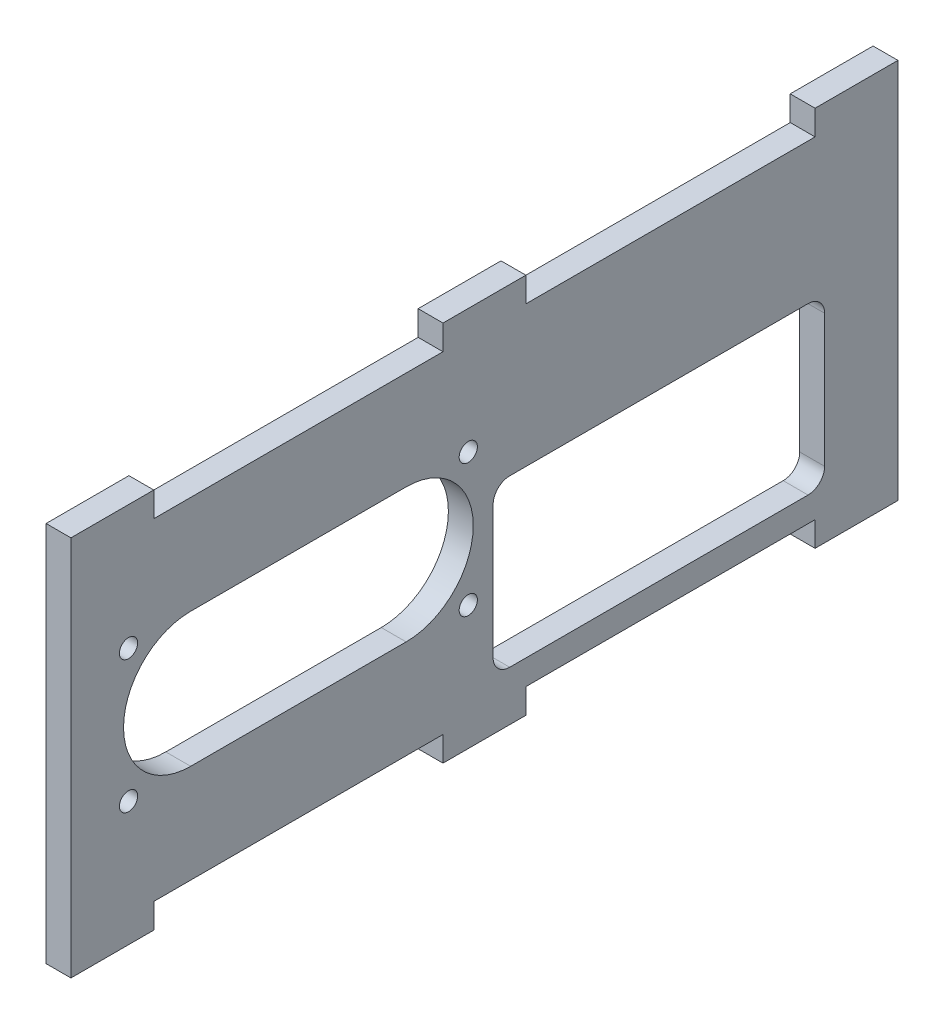
ISO-10303-21;
HEADER;
FILE_DESCRIPTION(('STEP AP214'),'2;1');
FILE_NAME('part.step','',(''),(''),'','','');
FILE_SCHEMA(('AUTOMOTIVE_DESIGN { 1 0 10303 214 1 1 1 1 }'));
ENDSEC;
DATA;
#1=APPLICATION_CONTEXT('core data for automotive mechanical design processes');
#2=APPLICATION_PROTOCOL_DEFINITION('international standard','automotive_design',2000,#1);
#3=PRODUCT_CONTEXT('',#1,'mechanical');
#4=PRODUCT('Part','Part','',(#3));
#5=PRODUCT_RELATED_PRODUCT_CATEGORY('part','',(#4));
#6=PRODUCT_DEFINITION_FORMATION('','',#4);
#7=PRODUCT_DEFINITION_CONTEXT('part definition',#1,'design');
#8=PRODUCT_DEFINITION('design','',#6,#7);
#9=PRODUCT_DEFINITION_SHAPE('','',#8);
#10=(LENGTH_UNIT() NAMED_UNIT(*) SI_UNIT(.MILLI.,.METRE.));
#11=(NAMED_UNIT(*) PLANE_ANGLE_UNIT() SI_UNIT($,.RADIAN.));
#12=(NAMED_UNIT(*) SI_UNIT($,.STERADIAN.) SOLID_ANGLE_UNIT());
#13=UNCERTAINTY_MEASURE_WITH_UNIT(LENGTH_MEASURE(1.E-05),#10,'distance_accuracy_value','');
#14=(GEOMETRIC_REPRESENTATION_CONTEXT(3) GLOBAL_UNCERTAINTY_ASSIGNED_CONTEXT((#13)) GLOBAL_UNIT_ASSIGNED_CONTEXT((#10,
#11,#12)) REPRESENTATION_CONTEXT('',''));
#15=CARTESIAN_POINT('',(0.,0.,0.));
#16=DIRECTION('',(0.,0.,1.));
#17=DIRECTION('',(1.,0.,0.));
#18=AXIS2_PLACEMENT_3D('',#15,#16,#17);
#19=CARTESIAN_POINT('',(3.,0.,-72.35));
#20=DIRECTION('',(0.,0.,-1.));
#21=DIRECTION('',(-1.,0.,0.));
#22=AXIS2_PLACEMENT_3D('',#19,#20,#21);
#23=PLANE('',#22);
#24=DIRECTION('',(0.,-1.,0.));
#25=VECTOR('',#24,1.);
#26=CARTESIAN_POINT('',(0.,0.,-72.35));
#27=LINE('',#26,#25);
#28=CARTESIAN_POINT('',(0.,23.,-72.35));
#29=VERTEX_POINT('',#28);
#30=CARTESIAN_POINT('',(0.,-23.,-72.35));
#31=VERTEX_POINT('',#30);
#32=EDGE_CURVE('E315',#29,#31,#27,.T.);
#33=ORIENTED_EDGE('',*,*,#32,.F.);
#34=DIRECTION('',(-1.,0.,0.));
#35=VECTOR('',#34,1.);
#36=CARTESIAN_POINT('',(3.,23.,-72.35));
#37=LINE('',#36,#35);
#38=CARTESIAN_POINT('',(3.,23.,-72.35));
#39=VERTEX_POINT('',#38);
#40=EDGE_CURVE('E515',#39,#29,#37,.T.);
#41=ORIENTED_EDGE('',*,*,#40,.F.);
#42=DIRECTION('',(0.,-1.,0.));
#43=VECTOR('',#42,1.);
#44=CARTESIAN_POINT('',(3.,0.,-72.35));
#45=LINE('',#44,#43);
#46=CARTESIAN_POINT('',(3.,-23.,-72.35));
#47=VERTEX_POINT('',#46);
#48=EDGE_CURVE('E319',#39,#47,#45,.T.);
#49=ORIENTED_EDGE('',*,*,#48,.T.);
#50=DIRECTION('',(-1.,0.,0.));
#51=VECTOR('',#50,1.);
#52=CARTESIAN_POINT('',(3.,-23.,-72.35));
#53=LINE('',#52,#51);
#54=EDGE_CURVE('E385',#47,#31,#53,.T.);
#55=ORIENTED_EDGE('',*,*,#54,.T.);
#56=EDGE_LOOP('',(#33,#41,#49,#55));
#57=FACE_BOUND('',#56,.T.);
#58=ADVANCED_FACE('F40',(#57),#23,.T.);
#59=CARTESIAN_POINT('',(3.,23.,0.));
#60=DIRECTION('',(0.,1.,0.));
#61=DIRECTION('',(0.,0.,1.));
#62=AXIS2_PLACEMENT_3D('',#59,#60,#61);
#63=PLANE('',#62);
#64=DIRECTION('',(0.,0.,-1.));
#65=VECTOR('',#64,1.);
#66=CARTESIAN_POINT('',(0.,23.,0.));
#67=LINE('',#66,#65);
#68=CARTESIAN_POINT('',(0.,23.,-62.35));
#69=VERTEX_POINT('',#68);
#70=EDGE_CURVE('E389',#69,#29,#67,.T.);
#71=ORIENTED_EDGE('',*,*,#70,.F.);
#72=DIRECTION('',(-1.,0.,0.));
#73=VECTOR('',#72,1.);
#74=CARTESIAN_POINT('',(3.,23.,-62.35));
#75=LINE('',#74,#73);
#76=CARTESIAN_POINT('',(3.,23.,-62.35));
#77=VERTEX_POINT('',#76);
#78=EDGE_CURVE('E512',#77,#69,#75,.T.);
#79=ORIENTED_EDGE('',*,*,#78,.F.);
#80=DIRECTION('',(0.,0.,-1.));
#81=VECTOR('',#80,1.);
#82=CARTESIAN_POINT('',(3.,23.,0.));
#83=LINE('',#82,#81);
#84=EDGE_CURVE('E323',#77,#39,#83,.T.);
#85=ORIENTED_EDGE('',*,*,#84,.T.);
#86=ORIENTED_EDGE('',*,*,#40,.T.);
#87=EDGE_LOOP('',(#71,#79,#85,#86));
#88=FACE_BOUND('',#87,.T.);
#89=ADVANCED_FACE('F651',(#88),#63,.T.);
#90=CARTESIAN_POINT('',(3.,1.44213344969539E-13,-62.3500000000001));
#91=DIRECTION('',(0.,0.,1.));
#92=DIRECTION('',(0.,-1.,0.));
#93=AXIS2_PLACEMENT_3D('',#90,#91,#92);
#94=PLANE('',#93);
#95=DIRECTION('',(0.,1.,0.));
#96=VECTOR('',#95,1.);
#97=CARTESIAN_POINT('',(0.,1.44213344969539E-13,-62.3500000000001));
#98=LINE('',#97,#96);
#99=CARTESIAN_POINT('',(0.,20.,-62.35));
#100=VERTEX_POINT('',#99);
#101=EDGE_CURVE('E393',#100,#69,#98,.T.);
#102=ORIENTED_EDGE('',*,*,#101,.F.);
#103=DIRECTION('',(-1.,0.,0.));
#104=VECTOR('',#103,1.);
#105=CARTESIAN_POINT('',(3.,20.,-62.35));
#106=LINE('',#105,#104);
#107=CARTESIAN_POINT('',(3.,20.,-62.35));
#108=VERTEX_POINT('',#107);
#109=EDGE_CURVE('E509',#108,#100,#106,.T.);
#110=ORIENTED_EDGE('',*,*,#109,.F.);
#111=DIRECTION('',(0.,1.,0.));
#112=VECTOR('',#111,1.);
#113=CARTESIAN_POINT('',(3.,1.44213344969539E-13,-62.3500000000001));
#114=LINE('',#113,#112);
#115=EDGE_CURVE('E328',#108,#77,#114,.T.);
#116=ORIENTED_EDGE('',*,*,#115,.T.);
#117=ORIENTED_EDGE('',*,*,#78,.T.);
#118=EDGE_LOOP('',(#102,#110,#116,#117));
#119=FACE_BOUND('',#118,.T.);
#120=ADVANCED_FACE('F655',(#119),#94,.T.);
#121=CARTESIAN_POINT('',(3.,20.,0.));
#122=DIRECTION('',(0.,1.,0.));
#123=DIRECTION('',(0.,0.,1.));
#124=AXIS2_PLACEMENT_3D('',#121,#122,#123);
#125=PLANE('',#124);
#126=DIRECTION('',(0.,0.,-1.));
#127=VECTOR('',#126,1.);
#128=CARTESIAN_POINT('',(0.,20.,0.));
#129=LINE('',#128,#127);
#130=CARTESIAN_POINT('',(0.,20.,-27.45));
#131=VERTEX_POINT('',#130);
#132=EDGE_CURVE('E397',#131,#100,#129,.T.);
#133=ORIENTED_EDGE('',*,*,#132,.F.);
#134=DIRECTION('',(-1.,0.,0.));
#135=VECTOR('',#134,1.);
#136=CARTESIAN_POINT('',(3.,20.,-27.45));
#137=LINE('',#136,#135);
#138=CARTESIAN_POINT('',(3.,20.,-27.45));
#139=VERTEX_POINT('',#138);
#140=EDGE_CURVE('E506',#139,#131,#137,.T.);
#141=ORIENTED_EDGE('',*,*,#140,.F.);
#142=DIRECTION('',(0.,0.,-1.));
#143=VECTOR('',#142,1.);
#144=CARTESIAN_POINT('',(3.,20.,0.));
#145=LINE('',#144,#143);
#146=EDGE_CURVE('E332',#139,#108,#145,.T.);
#147=ORIENTED_EDGE('',*,*,#146,.T.);
#148=ORIENTED_EDGE('',*,*,#109,.T.);
#149=EDGE_LOOP('',(#133,#141,#147,#148));
#150=FACE_BOUND('',#149,.T.);
#151=ADVANCED_FACE('F659',(#150),#125,.T.);
#152=CARTESIAN_POINT('',(3.,0.,-27.45));
#153=DIRECTION('',(0.,0.,1.));
#154=DIRECTION('',(1.,0.,0.));
#155=AXIS2_PLACEMENT_3D('',#152,#153,#154);
#156=PLANE('',#155);
#157=DIRECTION('',(0.,1.,0.));
#158=VECTOR('',#157,1.);
#159=CARTESIAN_POINT('',(0.,0.,-27.45));
#160=LINE('',#159,#158);
#161=CARTESIAN_POINT('',(0.,23.,-27.45));
#162=VERTEX_POINT('',#161);
#163=EDGE_CURVE('E401',#131,#162,#160,.T.);
#164=ORIENTED_EDGE('',*,*,#163,.T.);
#165=DIRECTION('',(-1.,0.,0.));
#166=VECTOR('',#165,1.);
#167=CARTESIAN_POINT('',(3.,23.,-27.45));
#168=LINE('',#167,#166);
#169=CARTESIAN_POINT('',(3.,23.,-27.45));
#170=VERTEX_POINT('',#169);
#171=EDGE_CURVE('E503',#170,#162,#168,.T.);
#172=ORIENTED_EDGE('',*,*,#171,.F.);
#173=DIRECTION('',(0.,1.,0.));
#174=VECTOR('',#173,1.);
#175=CARTESIAN_POINT('',(3.,0.,-27.45));
#176=LINE('',#175,#174);
#177=EDGE_CURVE('E336',#139,#170,#176,.T.);
#178=ORIENTED_EDGE('',*,*,#177,.F.);
#179=ORIENTED_EDGE('',*,*,#140,.T.);
#180=EDGE_LOOP('',(#164,#172,#178,#179));
#181=FACE_BOUND('',#180,.T.);
#182=ADVANCED_FACE('F664',(#181),#156,.F.);
#183=CARTESIAN_POINT('',(3.,23.,0.));
#184=DIRECTION('',(0.,1.,0.));
#185=DIRECTION('',(0.,0.,1.));
#186=AXIS2_PLACEMENT_3D('',#183,#184,#185);
#187=PLANE('',#186);
#188=DIRECTION('',(0.,0.,-1.));
#189=VECTOR('',#188,1.);
#190=CARTESIAN_POINT('',(0.,23.,0.));
#191=LINE('',#190,#189);
#192=CARTESIAN_POINT('',(0.,23.,-17.45));
#193=VERTEX_POINT('',#192);
#194=EDGE_CURVE('E406',#193,#162,#191,.T.);
#195=ORIENTED_EDGE('',*,*,#194,.F.);
#196=DIRECTION('',(-1.,0.,0.));
#197=VECTOR('',#196,1.);
#198=CARTESIAN_POINT('',(3.,23.,-17.45));
#199=LINE('',#198,#197);
#200=CARTESIAN_POINT('',(3.,23.,-17.45));
#201=VERTEX_POINT('',#200);
#202=EDGE_CURVE('E500',#201,#193,#199,.T.);
#203=ORIENTED_EDGE('',*,*,#202,.F.);
#204=DIRECTION('',(0.,0.,-1.));
#205=VECTOR('',#204,1.);
#206=CARTESIAN_POINT('',(3.,23.,0.));
#207=LINE('',#206,#205);
#208=EDGE_CURVE('E340',#201,#170,#207,.T.);
#209=ORIENTED_EDGE('',*,*,#208,.T.);
#210=ORIENTED_EDGE('',*,*,#171,.T.);
#211=EDGE_LOOP('',(#195,#203,#209,#210));
#212=FACE_BOUND('',#211,.T.);
#213=ADVANCED_FACE('F737',(#212),#187,.T.);
#214=CARTESIAN_POINT('',(3.,0.,-17.4500000000001));
#215=DIRECTION('',(0.,0.,1.));
#216=DIRECTION('',(0.,-1.,0.));
#217=AXIS2_PLACEMENT_3D('',#214,#215,#216);
#218=PLANE('',#217);
#219=DIRECTION('',(0.,1.,0.));
#220=VECTOR('',#219,1.);
#221=CARTESIAN_POINT('',(0.,0.,-17.4500000000001));
#222=LINE('',#221,#220);
#223=CARTESIAN_POINT('',(0.,20.,-17.45));
#224=VERTEX_POINT('',#223);
#225=EDGE_CURVE('E410',#224,#193,#222,.T.);
#226=ORIENTED_EDGE('',*,*,#225,.F.);
#227=DIRECTION('',(-1.,0.,0.));
#228=VECTOR('',#227,1.);
#229=CARTESIAN_POINT('',(3.,20.,-17.45));
#230=LINE('',#229,#228);
#231=CARTESIAN_POINT('',(3.,20.,-17.45));
#232=VERTEX_POINT('',#231);
#233=EDGE_CURVE('E497',#232,#224,#230,.T.);
#234=ORIENTED_EDGE('',*,*,#233,.F.);
#235=DIRECTION('',(0.,1.,0.));
#236=VECTOR('',#235,1.);
#237=CARTESIAN_POINT('',(3.,0.,-17.4500000000001));
#238=LINE('',#237,#236);
#239=EDGE_CURVE('E344',#232,#201,#238,.T.);
#240=ORIENTED_EDGE('',*,*,#239,.T.);
#241=ORIENTED_EDGE('',*,*,#202,.T.);
#242=EDGE_LOOP('',(#226,#234,#240,#241));
#243=FACE_BOUND('',#242,.T.);
#244=ADVANCED_FACE('F672',(#243),#218,.T.);
#245=CARTESIAN_POINT('',(0.,20.,17.45));
#246=VERTEX_POINT('',#245);
#247=EDGE_CURVE('E402',#246,#224,#129,.T.);
#248=ORIENTED_EDGE('',*,*,#247,.F.);
#249=DIRECTION('',(-1.,0.,0.));
#250=VECTOR('',#249,1.);
#251=CARTESIAN_POINT('',(3.,20.,17.45));
#252=LINE('',#251,#250);
#253=CARTESIAN_POINT('',(3.,20.,17.45));
#254=VERTEX_POINT('',#253);
#255=EDGE_CURVE('E494',#254,#246,#252,.T.);
#256=ORIENTED_EDGE('',*,*,#255,.F.);
#257=EDGE_CURVE('E337',#254,#232,#145,.T.);
#258=ORIENTED_EDGE('',*,*,#257,.T.);
#259=ORIENTED_EDGE('',*,*,#233,.T.);
#260=EDGE_LOOP('',(#248,#256,#258,#259));
#261=FACE_BOUND('',#260,.T.);
#262=ADVANCED_FACE('F677',(#261),#125,.T.);
#263=CARTESIAN_POINT('',(3.,0.,17.45));
#264=DIRECTION('',(0.,0.,1.));
#265=DIRECTION('',(1.,0.,0.));
#266=AXIS2_PLACEMENT_3D('',#263,#264,#265);
#267=PLANE('',#266);
#268=DIRECTION('',(0.,1.,0.));
#269=VECTOR('',#268,1.);
#270=CARTESIAN_POINT('',(0.,0.,17.45));
#271=LINE('',#270,#269);
#272=CARTESIAN_POINT('',(0.,23.,17.45));
#273=VERTEX_POINT('',#272);
#274=EDGE_CURVE('E414',#246,#273,#271,.T.);
#275=ORIENTED_EDGE('',*,*,#274,.T.);
#276=DIRECTION('',(-1.,0.,0.));
#277=VECTOR('',#276,1.);
#278=CARTESIAN_POINT('',(3.,23.,17.45));
#279=LINE('',#278,#277);
#280=CARTESIAN_POINT('',(3.,23.,17.45));
#281=VERTEX_POINT('',#280);
#282=EDGE_CURVE('E491',#281,#273,#279,.T.);
#283=ORIENTED_EDGE('',*,*,#282,.F.);
#284=DIRECTION('',(0.,1.,0.));
#285=VECTOR('',#284,1.);
#286=CARTESIAN_POINT('',(3.,0.,17.45));
#287=LINE('',#286,#285);
#288=EDGE_CURVE('E348',#254,#281,#287,.T.);
#289=ORIENTED_EDGE('',*,*,#288,.F.);
#290=ORIENTED_EDGE('',*,*,#255,.T.);
#291=EDGE_LOOP('',(#275,#283,#289,#290));
#292=FACE_BOUND('',#291,.T.);
#293=ADVANCED_FACE('F688',(#292),#267,.F.);
#294=CARTESIAN_POINT('',(3.,23.,0.));
#295=DIRECTION('',(0.,1.,0.));
#296=DIRECTION('',(0.,0.,1.));
#297=AXIS2_PLACEMENT_3D('',#294,#295,#296);
#298=PLANE('',#297);
#299=DIRECTION('',(0.,0.,-1.));
#300=VECTOR('',#299,1.);
#301=CARTESIAN_POINT('',(0.,23.,0.));
#302=LINE('',#301,#300);
#303=CARTESIAN_POINT('',(0.,23.,27.45));
#304=VERTEX_POINT('',#303);
#305=EDGE_CURVE('E418',#304,#273,#302,.T.);
#306=ORIENTED_EDGE('',*,*,#305,.F.);
#307=DIRECTION('',(-1.,0.,0.));
#308=VECTOR('',#307,1.);
#309=CARTESIAN_POINT('',(3.,23.,27.45));
#310=LINE('',#309,#308);
#311=CARTESIAN_POINT('',(3.,23.,27.45));
#312=VERTEX_POINT('',#311);
#313=EDGE_CURVE('E488',#312,#304,#310,.T.);
#314=ORIENTED_EDGE('',*,*,#313,.F.);
#315=DIRECTION('',(0.,0.,-1.));
#316=VECTOR('',#315,1.);
#317=CARTESIAN_POINT('',(3.,23.,0.));
#318=LINE('',#317,#316);
#319=EDGE_CURVE('E351',#312,#281,#318,.T.);
#320=ORIENTED_EDGE('',*,*,#319,.T.);
#321=ORIENTED_EDGE('',*,*,#282,.T.);
#322=EDGE_LOOP('',(#306,#314,#320,#321));
#323=FACE_BOUND('',#322,.T.);
#324=ADVANCED_FACE('F693',(#323),#298,.T.);
#325=CARTESIAN_POINT('',(3.,0.,27.45));
#326=DIRECTION('',(0.,0.,-1.));
#327=DIRECTION('',(0.,1.,0.));
#328=AXIS2_PLACEMENT_3D('',#325,#326,#327);
#329=PLANE('',#328);
#330=DIRECTION('',(0.,-1.,0.));
#331=VECTOR('',#330,1.);
#332=CARTESIAN_POINT('',(0.,0.,27.45));
#333=LINE('',#332,#331);
#334=CARTESIAN_POINT('',(0.,-23.,27.45));
#335=VERTEX_POINT('',#334);
#336=EDGE_CURVE('E422',#304,#335,#333,.T.);
#337=ORIENTED_EDGE('',*,*,#336,.T.);
#338=DIRECTION('',(-1.,0.,0.));
#339=VECTOR('',#338,1.);
#340=CARTESIAN_POINT('',(3.,-23.,27.45));
#341=LINE('',#340,#339);
#342=CARTESIAN_POINT('',(3.,-23.,27.45));
#343=VERTEX_POINT('',#342);
#344=EDGE_CURVE('E484',#343,#335,#341,.T.);
#345=ORIENTED_EDGE('',*,*,#344,.F.);
#346=DIRECTION('',(0.,-1.,0.));
#347=VECTOR('',#346,1.);
#348=CARTESIAN_POINT('',(3.,0.,27.45));
#349=LINE('',#348,#347);
#350=EDGE_CURVE('E355',#312,#343,#349,.T.);
#351=ORIENTED_EDGE('',*,*,#350,.F.);
#352=ORIENTED_EDGE('',*,*,#313,.T.);
#353=EDGE_LOOP('',(#337,#345,#351,#352));
#354=FACE_BOUND('',#353,.T.);
#355=ADVANCED_FACE('F695',(#354),#329,.F.);
#356=CARTESIAN_POINT('',(3.,-23.,0.));
#357=DIRECTION('',(0.,1.,0.));
#358=DIRECTION('',(0.,0.,1.));
#359=AXIS2_PLACEMENT_3D('',#356,#357,#358);
#360=PLANE('',#359);
#361=DIRECTION('',(0.,0.,-1.));
#362=VECTOR('',#361,1.);
#363=CARTESIAN_POINT('',(0.,-23.,0.));
#364=LINE('',#363,#362);
#365=CARTESIAN_POINT('',(0.,-23.,17.45));
#366=VERTEX_POINT('',#365);
#367=EDGE_CURVE('E425',#335,#366,#364,.T.);
#368=ORIENTED_EDGE('',*,*,#367,.T.);
#369=DIRECTION('',(-1.,0.,0.));
#370=VECTOR('',#369,1.);
#371=CARTESIAN_POINT('',(3.,-23.,17.45));
#372=LINE('',#371,#370);
#373=CARTESIAN_POINT('',(3.,-23.,17.45));
#374=VERTEX_POINT('',#373);
#375=EDGE_CURVE('E481',#374,#366,#372,.T.);
#376=ORIENTED_EDGE('',*,*,#375,.F.);
#377=DIRECTION('',(0.,0.,-1.));
#378=VECTOR('',#377,1.);
#379=CARTESIAN_POINT('',(3.,-23.,0.));
#380=LINE('',#379,#378);
#381=EDGE_CURVE('E358',#343,#374,#380,.T.);
#382=ORIENTED_EDGE('',*,*,#381,.F.);
#383=ORIENTED_EDGE('',*,*,#344,.T.);
#384=EDGE_LOOP('',(#368,#376,#382,#383));
#385=FACE_BOUND('',#384,.T.);
#386=ADVANCED_FACE('F700',(#385),#360,.F.);
#387=CARTESIAN_POINT('',(3.,1.81625547934769E-13,17.4499999999998));
#388=DIRECTION('',(0.,0.,-1.));
#389=DIRECTION('',(0.,1.,0.));
#390=AXIS2_PLACEMENT_3D('',#387,#388,#389);
#391=PLANE('',#390);
#392=DIRECTION('',(0.,-1.,0.));
#393=VECTOR('',#392,1.);
#394=CARTESIAN_POINT('',(0.,1.81625547934769E-13,17.4499999999998));
#395=LINE('',#394,#393);
#396=CARTESIAN_POINT('',(0.,-20.,17.45));
#397=VERTEX_POINT('',#396);
#398=EDGE_CURVE('E429',#397,#366,#395,.T.);
#399=ORIENTED_EDGE('',*,*,#398,.F.);
#400=DIRECTION('',(-1.,0.,0.));
#401=VECTOR('',#400,1.);
#402=CARTESIAN_POINT('',(3.,-20.,17.45));
#403=LINE('',#402,#401);
#404=CARTESIAN_POINT('',(3.,-20.,17.45));
#405=VERTEX_POINT('',#404);
#406=EDGE_CURVE('E478',#405,#397,#403,.T.);
#407=ORIENTED_EDGE('',*,*,#406,.F.);
#408=DIRECTION('',(0.,-1.,0.));
#409=VECTOR('',#408,1.);
#410=CARTESIAN_POINT('',(3.,1.81625547934769E-13,17.4499999999998));
#411=LINE('',#410,#409);
#412=EDGE_CURVE('E361',#405,#374,#411,.T.);
#413=ORIENTED_EDGE('',*,*,#412,.T.);
#414=ORIENTED_EDGE('',*,*,#375,.T.);
#415=EDGE_LOOP('',(#399,#407,#413,#414));
#416=FACE_BOUND('',#415,.T.);
#417=ADVANCED_FACE('F706',(#416),#391,.T.);
#418=CARTESIAN_POINT('',(3.,-20.,0.));
#419=DIRECTION('',(0.,1.,0.));
#420=DIRECTION('',(0.,0.,1.));
#421=AXIS2_PLACEMENT_3D('',#418,#419,#420);
#422=PLANE('',#421);
#423=DIRECTION('',(0.,0.,-1.));
#424=VECTOR('',#423,1.);
#425=CARTESIAN_POINT('',(0.,-20.,0.));
#426=LINE('',#425,#424);
#427=CARTESIAN_POINT('',(0.,-20.,-17.45));
#428=VERTEX_POINT('',#427);
#429=EDGE_CURVE('E433',#397,#428,#426,.T.);
#430=ORIENTED_EDGE('',*,*,#429,.T.);
#431=DIRECTION('',(-1.,0.,0.));
#432=VECTOR('',#431,1.);
#433=CARTESIAN_POINT('',(3.,-20.,-17.45));
#434=LINE('',#433,#432);
#435=CARTESIAN_POINT('',(3.,-20.,-17.45));
#436=VERTEX_POINT('',#435);
#437=EDGE_CURVE('E474',#436,#428,#434,.T.);
#438=ORIENTED_EDGE('',*,*,#437,.F.);
#439=DIRECTION('',(0.,0.,-1.));
#440=VECTOR('',#439,1.);
#441=CARTESIAN_POINT('',(3.,-20.,0.));
#442=LINE('',#441,#440);
#443=EDGE_CURVE('E365',#405,#436,#442,.T.);
#444=ORIENTED_EDGE('',*,*,#443,.F.);
#445=ORIENTED_EDGE('',*,*,#406,.T.);
#446=EDGE_LOOP('',(#430,#438,#444,#445));
#447=FACE_BOUND('',#446,.T.);
#448=ADVANCED_FACE('F709',(#447),#422,.F.);
#449=CARTESIAN_POINT('',(3.,1.00903082185984E-13,-17.4499999999999));
#450=DIRECTION('',(0.,0.,-1.));
#451=DIRECTION('',(0.,1.,0.));
#452=AXIS2_PLACEMENT_3D('',#449,#450,#451);
#453=PLANE('',#452);
#454=DIRECTION('',(0.,-1.,0.));
#455=VECTOR('',#454,1.);
#456=CARTESIAN_POINT('',(0.,1.00903082185984E-13,-17.4499999999999));
#457=LINE('',#456,#455);
#458=CARTESIAN_POINT('',(0.,-23.,-17.45));
#459=VERTEX_POINT('',#458);
#460=EDGE_CURVE('E436',#428,#459,#457,.T.);
#461=ORIENTED_EDGE('',*,*,#460,.T.);
#462=DIRECTION('',(-1.,0.,0.));
#463=VECTOR('',#462,1.);
#464=CARTESIAN_POINT('',(3.,-23.,-17.45));
#465=LINE('',#464,#463);
#466=CARTESIAN_POINT('',(3.,-23.,-17.45));
#467=VERTEX_POINT('',#466);
#468=EDGE_CURVE('E470',#467,#459,#465,.T.);
#469=ORIENTED_EDGE('',*,*,#468,.F.);
#470=DIRECTION('',(0.,-1.,0.));
#471=VECTOR('',#470,1.);
#472=CARTESIAN_POINT('',(3.,1.00903082185984E-13,-17.4499999999999));
#473=LINE('',#472,#471);
#474=EDGE_CURVE('E368',#436,#467,#473,.T.);
#475=ORIENTED_EDGE('',*,*,#474,.F.);
#476=ORIENTED_EDGE('',*,*,#437,.T.);
#477=EDGE_LOOP('',(#461,#469,#475,#476));
#478=FACE_BOUND('',#477,.T.);
#479=ADVANCED_FACE('F714',(#478),#453,.F.);
#480=CARTESIAN_POINT('',(3.,-23.,0.));
#481=DIRECTION('',(0.,1.,0.));
#482=DIRECTION('',(0.,0.,1.));
#483=AXIS2_PLACEMENT_3D('',#480,#481,#482);
#484=PLANE('',#483);
#485=DIRECTION('',(0.,0.,-1.));
#486=VECTOR('',#485,1.);
#487=CARTESIAN_POINT('',(0.,-23.,0.));
#488=LINE('',#487,#486);
#489=CARTESIAN_POINT('',(0.,-23.,-27.45));
#490=VERTEX_POINT('',#489);
#491=EDGE_CURVE('E440',#459,#490,#488,.T.);
#492=ORIENTED_EDGE('',*,*,#491,.T.);
#493=DIRECTION('',(-1.,0.,0.));
#494=VECTOR('',#493,1.);
#495=CARTESIAN_POINT('',(3.,-23.,-27.45));
#496=LINE('',#495,#494);
#497=CARTESIAN_POINT('',(3.,-23.,-27.45));
#498=VERTEX_POINT('',#497);
#499=EDGE_CURVE('E467',#498,#490,#496,.T.);
#500=ORIENTED_EDGE('',*,*,#499,.F.);
#501=DIRECTION('',(0.,0.,-1.));
#502=VECTOR('',#501,1.);
#503=CARTESIAN_POINT('',(3.,-23.,0.));
#504=LINE('',#503,#502);
#505=EDGE_CURVE('E372',#467,#498,#504,.T.);
#506=ORIENTED_EDGE('',*,*,#505,.F.);
#507=ORIENTED_EDGE('',*,*,#468,.T.);
#508=EDGE_LOOP('',(#492,#500,#506,#507));
#509=FACE_BOUND('',#508,.T.);
#510=ADVANCED_FACE('F719',(#509),#484,.F.);
#511=CARTESIAN_POINT('',(3.,0.,-27.45));
#512=DIRECTION('',(0.,0.,-1.));
#513=DIRECTION('',(-1.,0.,0.));
#514=AXIS2_PLACEMENT_3D('',#511,#512,#513);
#515=PLANE('',#514);
#516=DIRECTION('',(0.,-1.,0.));
#517=VECTOR('',#516,1.);
#518=CARTESIAN_POINT('',(0.,0.,-27.45));
#519=LINE('',#518,#517);
#520=CARTESIAN_POINT('',(0.,-20.,-27.45));
#521=VERTEX_POINT('',#520);
#522=EDGE_CURVE('E444',#521,#490,#519,.T.);
#523=ORIENTED_EDGE('',*,*,#522,.F.);
#524=DIRECTION('',(-1.,0.,0.));
#525=VECTOR('',#524,1.);
#526=CARTESIAN_POINT('',(3.,-20.,-27.45));
#527=LINE('',#526,#525);
#528=CARTESIAN_POINT('',(3.,-20.,-27.45));
#529=VERTEX_POINT('',#528);
#530=EDGE_CURVE('E464',#529,#521,#527,.T.);
#531=ORIENTED_EDGE('',*,*,#530,.F.);
#532=DIRECTION('',(0.,-1.,0.));
#533=VECTOR('',#532,1.);
#534=CARTESIAN_POINT('',(3.,0.,-27.45));
#535=LINE('',#534,#533);
#536=EDGE_CURVE('E375',#529,#498,#535,.T.);
#537=ORIENTED_EDGE('',*,*,#536,.T.);
#538=ORIENTED_EDGE('',*,*,#499,.T.);
#539=EDGE_LOOP('',(#523,#531,#537,#538));
#540=FACE_BOUND('',#539,.T.);
#541=ADVANCED_FACE('F723',(#540),#515,.T.);
#542=CARTESIAN_POINT('',(0.,-20.,-62.35));
#543=VERTEX_POINT('',#542);
#544=EDGE_CURVE('E437',#521,#543,#426,.T.);
#545=ORIENTED_EDGE('',*,*,#544,.T.);
#546=DIRECTION('',(-1.,0.,0.));
#547=VECTOR('',#546,1.);
#548=CARTESIAN_POINT('',(3.,-20.,-62.35));
#549=LINE('',#548,#547);
#550=CARTESIAN_POINT('',(3.,-20.,-62.35));
#551=VERTEX_POINT('',#550);
#552=EDGE_CURVE('E460',#551,#543,#549,.T.);
#553=ORIENTED_EDGE('',*,*,#552,.F.);
#554=EDGE_CURVE('E369',#529,#551,#442,.T.);
#555=ORIENTED_EDGE('',*,*,#554,.F.);
#556=ORIENTED_EDGE('',*,*,#530,.T.);
#557=EDGE_LOOP('',(#545,#553,#555,#556));
#558=FACE_BOUND('',#557,.T.);
#559=ADVANCED_FACE('F728',(#558),#422,.F.);
#560=CARTESIAN_POINT('',(3.,-1.44213344969539E-13,-62.3500000000001));
#561=DIRECTION('',(0.,0.,-1.));
#562=DIRECTION('',(0.,1.,0.));
#563=AXIS2_PLACEMENT_3D('',#560,#561,#562);
#564=PLANE('',#563);
#565=DIRECTION('',(0.,-1.,0.));
#566=VECTOR('',#565,1.);
#567=CARTESIAN_POINT('',(0.,-1.44213344969539E-13,-62.3500000000001));
#568=LINE('',#567,#566);
#569=CARTESIAN_POINT('',(0.,-23.,-62.35));
#570=VERTEX_POINT('',#569);
#571=EDGE_CURVE('E448',#543,#570,#568,.T.);
#572=ORIENTED_EDGE('',*,*,#571,.T.);
#573=DIRECTION('',(-1.,0.,0.));
#574=VECTOR('',#573,1.);
#575=CARTESIAN_POINT('',(3.,-23.,-62.35));
#576=LINE('',#575,#574);
#577=CARTESIAN_POINT('',(3.,-23.,-62.35));
#578=VERTEX_POINT('',#577);
#579=EDGE_CURVE('E456',#578,#570,#576,.T.);
#580=ORIENTED_EDGE('',*,*,#579,.F.);
#581=DIRECTION('',(0.,-1.,0.));
#582=VECTOR('',#581,1.);
#583=CARTESIAN_POINT('',(3.,-1.44213344969539E-13,-62.3500000000001));
#584=LINE('',#583,#582);
#585=EDGE_CURVE('E379',#551,#578,#584,.T.);
#586=ORIENTED_EDGE('',*,*,#585,.F.);
#587=ORIENTED_EDGE('',*,*,#552,.T.);
#588=EDGE_LOOP('',(#572,#580,#586,#587));
#589=FACE_BOUND('',#588,.T.);
#590=ADVANCED_FACE('F733',(#589),#564,.F.);
#591=CARTESIAN_POINT('',(3.,-23.,0.));
#592=DIRECTION('',(0.,1.,0.));
#593=DIRECTION('',(0.,0.,1.));
#594=AXIS2_PLACEMENT_3D('',#591,#592,#593);
#595=PLANE('',#594);
#596=DIRECTION('',(0.,0.,-1.));
#597=VECTOR('',#596,1.);
#598=CARTESIAN_POINT('',(0.,-23.,0.));
#599=LINE('',#598,#597);
#600=EDGE_CURVE('E324',#570,#31,#599,.T.);
#601=ORIENTED_EDGE('',*,*,#600,.T.);
#602=ORIENTED_EDGE('',*,*,#54,.F.);
#603=DIRECTION('',(0.,0.,-1.));
#604=VECTOR('',#603,1.);
#605=CARTESIAN_POINT('',(3.,-23.,0.));
#606=LINE('',#605,#604);
#607=EDGE_CURVE('E382',#578,#47,#606,.T.);
#608=ORIENTED_EDGE('',*,*,#607,.F.);
#609=ORIENTED_EDGE('',*,*,#579,.T.);
#610=EDGE_LOOP('',(#601,#602,#608,#609));
#611=FACE_BOUND('',#610,.T.);
#612=ADVANCED_FACE('F633',(#611),#595,.F.);
#613=CARTESIAN_POINT('',(3.,0.,0.));
#614=DIRECTION('',(1.,0.,0.));
#615=DIRECTION('',(0.,0.,-1.));
#616=AXIS2_PLACEMENT_3D('',#613,#614,#615);
#617=PLANE('',#616);
#618=DIRECTION('',(0.,-1.,0.));
#619=VECTOR('',#618,1.);
#620=CARTESIAN_POINT('',(3.,3.,-23.5));
#621=LINE('',#620,#619);
#622=CARTESIAN_POINT('',(3.,0.999999999999999,-23.5));
#623=VERTEX_POINT('',#622);
#624=CARTESIAN_POINT('',(3.,-15.,-23.5));
#625=VERTEX_POINT('',#624);
#626=EDGE_CURVE('E569',#623,#625,#621,.T.);
#627=ORIENTED_EDGE('',*,*,#626,.F.);
#628=CARTESIAN_POINT('',(3.,0.999999999999999,-25.5));
#629=DIRECTION('',(1.,0.,0.));
#630=DIRECTION('',(0.,0.,-1.));
#631=AXIS2_PLACEMENT_3D('',#628,#629,#630);
#632=CIRCLE('',#631,2.);
#633=CARTESIAN_POINT('',(3.,3.,-25.5));
#634=VERTEX_POINT('',#633);
#635=EDGE_CURVE('E49',#623,#634,#632,.F.);
#636=ORIENTED_EDGE('',*,*,#635,.T.);
#637=DIRECTION('',(0.,0.,1.));
#638=VECTOR('',#637,1.);
#639=CARTESIAN_POINT('',(3.,3.,-23.5));
#640=LINE('',#639,#638);
#641=CARTESIAN_POINT('',(3.,3.,-61.5));
#642=VERTEX_POINT('',#641);
#643=EDGE_CURVE('E567',#642,#634,#640,.T.);
#644=ORIENTED_EDGE('',*,*,#643,.F.);
#645=CARTESIAN_POINT('',(3.,0.999999999999999,-61.5));
#646=DIRECTION('',(1.,0.,0.));
#647=DIRECTION('',(0.,0.,-1.));
#648=AXIS2_PLACEMENT_3D('',#645,#646,#647);
#649=CIRCLE('',#648,2.);
#650=CARTESIAN_POINT('',(3.,0.999999999999999,-63.5));
#651=VERTEX_POINT('',#650);
#652=EDGE_CURVE('E557',#642,#651,#649,.F.);
#653=ORIENTED_EDGE('',*,*,#652,.T.);
#654=DIRECTION('',(0.,1.,0.));
#655=VECTOR('',#654,1.);
#656=CARTESIAN_POINT('',(3.,3.,-63.5));
#657=LINE('',#656,#655);
#658=CARTESIAN_POINT('',(3.,-15.,-63.5));
#659=VERTEX_POINT('',#658);
#660=EDGE_CURVE('E576',#659,#651,#657,.T.);
#661=ORIENTED_EDGE('',*,*,#660,.F.);
#662=CARTESIAN_POINT('',(3.,-15.,-61.5));
#663=DIRECTION('',(1.,0.,0.));
#664=DIRECTION('',(0.,0.,-1.));
#665=AXIS2_PLACEMENT_3D('',#662,#663,#664);
#666=CIRCLE('',#665,2.);
#667=CARTESIAN_POINT('',(3.,-17.,-61.5));
#668=VERTEX_POINT('',#667);
#669=EDGE_CURVE('E551',#659,#668,#666,.F.);
#670=ORIENTED_EDGE('',*,*,#669,.T.);
#671=DIRECTION('',(0.,0.,-1.));
#672=VECTOR('',#671,1.);
#673=CARTESIAN_POINT('',(3.,-17.,-23.5));
#674=LINE('',#673,#672);
#675=CARTESIAN_POINT('',(3.,-17.,-25.5));
#676=VERTEX_POINT('',#675);
#677=EDGE_CURVE('E602',#676,#668,#674,.T.);
#678=ORIENTED_EDGE('',*,*,#677,.F.);
#679=CARTESIAN_POINT('',(3.,-15.,-25.5));
#680=DIRECTION('',(1.,0.,0.));
#681=DIRECTION('',(0.,0.,-1.));
#682=AXIS2_PLACEMENT_3D('',#679,#680,#681);
#683=CIRCLE('',#682,2.);
#684=EDGE_CURVE('E545',#676,#625,#683,.F.);
#685=ORIENTED_EDGE('',*,*,#684,.T.);
#686=EDGE_LOOP('',(#627,#636,#644,#653,#661,#670,#678,#685));
#687=FACE_BOUND('',#686,.T.);
#688=CARTESIAN_POINT('',(3.,-8.,20.5));
#689=DIRECTION('',(1.,0.,0.));
#690=DIRECTION('',(0.,0.,-1.));
#691=AXIS2_PLACEMENT_3D('',#688,#689,#690);
#692=CIRCLE('',#691,1.1);
#693=CARTESIAN_POINT('',(3.,-8.,19.4));
#694=VERTEX_POINT('',#693);
#695=EDGE_CURVE('E286',#694,#694,#692,.T.);
#696=ORIENTED_EDGE('',*,*,#695,.F.);
#697=EDGE_LOOP('',(#696));
#698=FACE_BOUND('',#697,.T.);
#699=CARTESIAN_POINT('',(3.,0.,13.));
#700=DIRECTION('',(1.,0.,0.));
#701=DIRECTION('',(0.,0.,-1.));
#702=AXIS2_PLACEMENT_3D('',#699,#700,#701);
#703=CIRCLE('',#702,8.1);
#704=CARTESIAN_POINT('',(3.,8.1,13.));
#705=VERTEX_POINT('',#704);
#706=CARTESIAN_POINT('',(3.,-8.1,13.));
#707=VERTEX_POINT('',#706);
#708=EDGE_CURVE('E258',#705,#707,#703,.T.);
#709=ORIENTED_EDGE('',*,*,#708,.F.);
#710=DIRECTION('',(0.,0.,1.));
#711=VECTOR('',#710,1.);
#712=CARTESIAN_POINT('',(3.,8.1,13.));
#713=LINE('',#712,#711);
#714=CARTESIAN_POINT('',(3.,8.1,-13.));
#715=VERTEX_POINT('',#714);
#716=EDGE_CURVE('E279',#715,#705,#713,.T.);
#717=ORIENTED_EDGE('',*,*,#716,.F.);
#718=CARTESIAN_POINT('',(3.,0.,-13.));
#719=DIRECTION('',(1.,0.,0.));
#720=DIRECTION('',(0.,0.,-1.));
#721=AXIS2_PLACEMENT_3D('',#718,#719,#720);
#722=CIRCLE('',#721,8.1);
#723=CARTESIAN_POINT('',(3.,-8.1,-13.));
#724=VERTEX_POINT('',#723);
#725=EDGE_CURVE('E283',#724,#715,#722,.T.);
#726=ORIENTED_EDGE('',*,*,#725,.F.);
#727=DIRECTION('',(0.,0.,-1.));
#728=VECTOR('',#727,1.);
#729=CARTESIAN_POINT('',(3.,-8.1,13.));
#730=LINE('',#729,#728);
#731=EDGE_CURVE('E295',#707,#724,#730,.T.);
#732=ORIENTED_EDGE('',*,*,#731,.F.);
#733=EDGE_LOOP('',(#709,#717,#726,#732));
#734=FACE_BOUND('',#733,.T.);
#735=CARTESIAN_POINT('',(3.,8.,-20.5));
#736=DIRECTION('',(1.,0.,0.));
#737=DIRECTION('',(0.,0.,-1.));
#738=AXIS2_PLACEMENT_3D('',#735,#736,#737);
#739=CIRCLE('',#738,1.1);
#740=CARTESIAN_POINT('',(3.,8.,-21.6));
#741=VERTEX_POINT('',#740);
#742=EDGE_CURVE('E613',#741,#741,#739,.T.);
#743=ORIENTED_EDGE('',*,*,#742,.F.);
#744=EDGE_LOOP('',(#743));
#745=FACE_BOUND('',#744,.T.);
#746=CARTESIAN_POINT('',(3.,-8.,-20.5));
#747=DIRECTION('',(1.,0.,0.));
#748=DIRECTION('',(0.,0.,-1.));
#749=AXIS2_PLACEMENT_3D('',#746,#747,#748);
#750=CIRCLE('',#749,1.1);
#751=CARTESIAN_POINT('',(3.,-8.,-21.6));
#752=VERTEX_POINT('',#751);
#753=EDGE_CURVE('E599',#752,#752,#750,.T.);
#754=ORIENTED_EDGE('',*,*,#753,.F.);
#755=EDGE_LOOP('',(#754));
#756=FACE_BOUND('',#755,.T.);
#757=CARTESIAN_POINT('',(3.,8.,20.5));
#758=DIRECTION('',(1.,0.,0.));
#759=DIRECTION('',(0.,0.,-1.));
#760=AXIS2_PLACEMENT_3D('',#757,#758,#759);
#761=CIRCLE('',#760,1.1);
#762=CARTESIAN_POINT('',(3.,8.,19.4));
#763=VERTEX_POINT('',#762);
#764=EDGE_CURVE('E305',#763,#763,#761,.T.);
#765=ORIENTED_EDGE('',*,*,#764,.F.);
#766=EDGE_LOOP('',(#765));
#767=FACE_BOUND('',#766,.T.);
#768=ORIENTED_EDGE('',*,*,#48,.F.);
#769=ORIENTED_EDGE('',*,*,#84,.F.);
#770=ORIENTED_EDGE('',*,*,#115,.F.);
#771=ORIENTED_EDGE('',*,*,#146,.F.);
#772=ORIENTED_EDGE('',*,*,#177,.T.);
#773=ORIENTED_EDGE('',*,*,#208,.F.);
#774=ORIENTED_EDGE('',*,*,#239,.F.);
#775=ORIENTED_EDGE('',*,*,#257,.F.);
#776=ORIENTED_EDGE('',*,*,#288,.T.);
#777=ORIENTED_EDGE('',*,*,#319,.F.);
#778=ORIENTED_EDGE('',*,*,#350,.T.);
#779=ORIENTED_EDGE('',*,*,#381,.T.);
#780=ORIENTED_EDGE('',*,*,#412,.F.);
#781=ORIENTED_EDGE('',*,*,#443,.T.);
#782=ORIENTED_EDGE('',*,*,#474,.T.);
#783=ORIENTED_EDGE('',*,*,#505,.T.);
#784=ORIENTED_EDGE('',*,*,#536,.F.);
#785=ORIENTED_EDGE('',*,*,#554,.T.);
#786=ORIENTED_EDGE('',*,*,#585,.T.);
#787=ORIENTED_EDGE('',*,*,#607,.T.);
#788=EDGE_LOOP('',(#768,#769,#770,#771,#772,#773,#774,#775,#776,#777,#778,#779,#780,#781,#782,
#783,#784,#785,#786,#787));
#789=FACE_BOUND('',#788,.T.);
#790=ADVANCED_FACE('F565',(#687,#698,#734,#745,#756,#767,#789),#617,.T.);
#791=CARTESIAN_POINT('',(0.,0.,0.));
#792=DIRECTION('',(1.,0.,0.));
#793=DIRECTION('',(0.,0.,-1.));
#794=AXIS2_PLACEMENT_3D('',#791,#792,#793);
#795=PLANE('',#794);
#796=DIRECTION('',(0.,1.,0.));
#797=VECTOR('',#796,1.);
#798=CARTESIAN_POINT('',(0.,3.,-63.5));
#799=LINE('',#798,#797);
#800=CARTESIAN_POINT('',(0.,-15.,-63.5));
#801=VERTEX_POINT('',#800);
#802=CARTESIAN_POINT('',(0.,0.999999999999999,-63.5));
#803=VERTEX_POINT('',#802);
#804=EDGE_CURVE('E592',#801,#803,#799,.T.);
#805=ORIENTED_EDGE('',*,*,#804,.T.);
#806=CARTESIAN_POINT('',(0.,0.999999999999999,-61.5));
#807=DIRECTION('',(1.,0.,0.));
#808=DIRECTION('',(0.,0.,-1.));
#809=AXIS2_PLACEMENT_3D('',#806,#807,#808);
#810=CIRCLE('',#809,2.);
#811=CARTESIAN_POINT('',(0.,3.,-61.5));
#812=VERTEX_POINT('',#811);
#813=EDGE_CURVE('E63',#803,#812,#810,.T.);
#814=ORIENTED_EDGE('',*,*,#813,.T.);
#815=DIRECTION('',(0.,0.,1.));
#816=VECTOR('',#815,1.);
#817=CARTESIAN_POINT('',(0.,3.,-23.5));
#818=LINE('',#817,#816);
#819=CARTESIAN_POINT('',(0.,3.,-25.5));
#820=VERTEX_POINT('',#819);
#821=EDGE_CURVE('E583',#812,#820,#818,.T.);
#822=ORIENTED_EDGE('',*,*,#821,.T.);
#823=CARTESIAN_POINT('',(0.,0.999999999999999,-25.5));
#824=DIRECTION('',(1.,0.,0.));
#825=DIRECTION('',(0.,0.,-1.));
#826=AXIS2_PLACEMENT_3D('',#823,#824,#825);
#827=CIRCLE('',#826,2.);
#828=CARTESIAN_POINT('',(0.,0.999999999999999,-23.5));
#829=VERTEX_POINT('',#828);
#830=EDGE_CURVE('E11',#820,#829,#827,.T.);
#831=ORIENTED_EDGE('',*,*,#830,.T.);
#832=DIRECTION('',(0.,-1.,0.));
#833=VECTOR('',#832,1.);
#834=CARTESIAN_POINT('',(0.,3.,-23.5));
#835=LINE('',#834,#833);
#836=CARTESIAN_POINT('',(0.,-15.,-23.5));
#837=VERTEX_POINT('',#836);
#838=EDGE_CURVE('E575',#829,#837,#835,.T.);
#839=ORIENTED_EDGE('',*,*,#838,.T.);
#840=CARTESIAN_POINT('',(0.,-15.,-25.5));
#841=DIRECTION('',(1.,0.,0.));
#842=DIRECTION('',(0.,0.,-1.));
#843=AXIS2_PLACEMENT_3D('',#840,#841,#842);
#844=CIRCLE('',#843,2.);
#845=CARTESIAN_POINT('',(0.,-17.,-25.5));
#846=VERTEX_POINT('',#845);
#847=EDGE_CURVE('E548',#837,#846,#844,.T.);
#848=ORIENTED_EDGE('',*,*,#847,.T.);
#849=DIRECTION('',(0.,0.,-1.));
#850=VECTOR('',#849,1.);
#851=CARTESIAN_POINT('',(0.,-17.,-23.5));
#852=LINE('',#851,#850);
#853=CARTESIAN_POINT('',(0.,-17.,-61.5));
#854=VERTEX_POINT('',#853);
#855=EDGE_CURVE('E588',#846,#854,#852,.T.);
#856=ORIENTED_EDGE('',*,*,#855,.T.);
#857=CARTESIAN_POINT('',(0.,-15.,-61.5));
#858=DIRECTION('',(1.,0.,0.));
#859=DIRECTION('',(0.,0.,-1.));
#860=AXIS2_PLACEMENT_3D('',#857,#858,#859);
#861=CIRCLE('',#860,2.);
#862=EDGE_CURVE('E554',#854,#801,#861,.T.);
#863=ORIENTED_EDGE('',*,*,#862,.T.);
#864=EDGE_LOOP('',(#805,#814,#822,#831,#839,#848,#856,#863));
#865=FACE_BOUND('',#864,.T.);
#866=CARTESIAN_POINT('',(0.,-8.,20.5));
#867=DIRECTION('',(1.,0.,0.));
#868=DIRECTION('',(0.,0.,-1.));
#869=AXIS2_PLACEMENT_3D('',#866,#867,#868);
#870=CIRCLE('',#869,1.1);
#871=CARTESIAN_POINT('',(0.,-8.,19.4));
#872=VERTEX_POINT('',#871);
#873=EDGE_CURVE('E296',#872,#872,#870,.T.);
#874=ORIENTED_EDGE('',*,*,#873,.T.);
#875=EDGE_LOOP('',(#874));
#876=FACE_BOUND('',#875,.T.);
#877=DIRECTION('',(0.,0.,1.));
#878=VECTOR('',#877,1.);
#879=CARTESIAN_POINT('',(0.,8.1,13.));
#880=LINE('',#879,#878);
#881=CARTESIAN_POINT('',(0.,8.1,-13.));
#882=VERTEX_POINT('',#881);
#883=CARTESIAN_POINT('',(0.,8.1,13.));
#884=VERTEX_POINT('',#883);
#885=EDGE_CURVE('E264',#882,#884,#880,.T.);
#886=ORIENTED_EDGE('',*,*,#885,.T.);
#887=CARTESIAN_POINT('',(0.,0.,13.));
#888=DIRECTION('',(1.,0.,0.));
#889=DIRECTION('',(0.,0.,-1.));
#890=AXIS2_PLACEMENT_3D('',#887,#888,#889);
#891=CIRCLE('',#890,8.1);
#892=CARTESIAN_POINT('',(0.,-8.1,13.));
#893=VERTEX_POINT('',#892);
#894=EDGE_CURVE('E255',#884,#893,#891,.T.);
#895=ORIENTED_EDGE('',*,*,#894,.T.);
#896=DIRECTION('',(0.,0.,-1.));
#897=VECTOR('',#896,1.);
#898=CARTESIAN_POINT('',(0.,-8.1,13.));
#899=LINE('',#898,#897);
#900=CARTESIAN_POINT('',(0.,-8.1,-13.));
#901=VERTEX_POINT('',#900);
#902=EDGE_CURVE('E268',#893,#901,#899,.T.);
#903=ORIENTED_EDGE('',*,*,#902,.T.);
#904=CARTESIAN_POINT('',(0.,0.,-13.));
#905=DIRECTION('',(1.,0.,0.));
#906=DIRECTION('',(0.,0.,-1.));
#907=AXIS2_PLACEMENT_3D('',#904,#905,#906);
#908=CIRCLE('',#907,8.1);
#909=EDGE_CURVE('E273',#901,#882,#908,.T.);
#910=ORIENTED_EDGE('',*,*,#909,.T.);
#911=EDGE_LOOP('',(#886,#895,#903,#910));
#912=FACE_BOUND('',#911,.T.);
#913=CARTESIAN_POINT('',(0.,8.,-20.5));
#914=DIRECTION('',(1.,0.,0.));
#915=DIRECTION('',(0.,0.,-1.));
#916=AXIS2_PLACEMENT_3D('',#913,#914,#915);
#917=CIRCLE('',#916,1.1);
#918=CARTESIAN_POINT('',(0.,8.,-21.6));
#919=VERTEX_POINT('',#918);
#920=EDGE_CURVE('E609',#919,#919,#917,.T.);
#921=ORIENTED_EDGE('',*,*,#920,.T.);
#922=EDGE_LOOP('',(#921));
#923=FACE_BOUND('',#922,.T.);
#924=CARTESIAN_POINT('',(0.,-8.,-20.5));
#925=DIRECTION('',(1.,0.,0.));
#926=DIRECTION('',(0.,0.,-1.));
#927=AXIS2_PLACEMENT_3D('',#924,#925,#926);
#928=CIRCLE('',#927,1.1);
#929=CARTESIAN_POINT('',(0.,-8.,-21.6));
#930=VERTEX_POINT('',#929);
#931=EDGE_CURVE('E617',#930,#930,#928,.T.);
#932=ORIENTED_EDGE('',*,*,#931,.T.);
#933=EDGE_LOOP('',(#932));
#934=FACE_BOUND('',#933,.T.);
#935=CARTESIAN_POINT('',(0.,8.,20.5));
#936=DIRECTION('',(1.,0.,0.));
#937=DIRECTION('',(0.,0.,-1.));
#938=AXIS2_PLACEMENT_3D('',#935,#936,#937);
#939=CIRCLE('',#938,1.1);
#940=CARTESIAN_POINT('',(0.,8.,19.4));
#941=VERTEX_POINT('',#940);
#942=EDGE_CURVE('E311',#941,#941,#939,.T.);
#943=ORIENTED_EDGE('',*,*,#942,.T.);
#944=EDGE_LOOP('',(#943));
#945=FACE_BOUND('',#944,.T.);
#946=ORIENTED_EDGE('',*,*,#32,.T.);
#947=ORIENTED_EDGE('',*,*,#600,.F.);
#948=ORIENTED_EDGE('',*,*,#571,.F.);
#949=ORIENTED_EDGE('',*,*,#544,.F.);
#950=ORIENTED_EDGE('',*,*,#522,.T.);
#951=ORIENTED_EDGE('',*,*,#491,.F.);
#952=ORIENTED_EDGE('',*,*,#460,.F.);
#953=ORIENTED_EDGE('',*,*,#429,.F.);
#954=ORIENTED_EDGE('',*,*,#398,.T.);
#955=ORIENTED_EDGE('',*,*,#367,.F.);
#956=ORIENTED_EDGE('',*,*,#336,.F.);
#957=ORIENTED_EDGE('',*,*,#305,.T.);
#958=ORIENTED_EDGE('',*,*,#274,.F.);
#959=ORIENTED_EDGE('',*,*,#247,.T.);
#960=ORIENTED_EDGE('',*,*,#225,.T.);
#961=ORIENTED_EDGE('',*,*,#194,.T.);
#962=ORIENTED_EDGE('',*,*,#163,.F.);
#963=ORIENTED_EDGE('',*,*,#132,.T.);
#964=ORIENTED_EDGE('',*,*,#101,.T.);
#965=ORIENTED_EDGE('',*,*,#70,.T.);
#966=EDGE_LOOP('',(#946,#947,#948,#949,#950,#951,#952,#953,#954,#955,#956,#957,#958,#959,#960,
#961,#962,#963,#964,#965));
#967=FACE_BOUND('',#966,.T.);
#968=ADVANCED_FACE('F275',(#865,#876,#912,#923,#934,#945,#967),#795,.F.);
#969=CARTESIAN_POINT('',(0.,8.,20.5));
#970=DIRECTION('',(1.,0.,0.));
#971=DIRECTION('',(0.,0.,-1.));
#972=AXIS2_PLACEMENT_3D('',#969,#970,#971);
#973=CYLINDRICAL_SURFACE('',#972,1.1);
#974=ORIENTED_EDGE('',*,*,#942,.F.);
#975=EDGE_LOOP('',(#974));
#976=FACE_BOUND('',#975,.T.);
#977=ORIENTED_EDGE('',*,*,#764,.T.);
#978=EDGE_LOOP('',(#977));
#979=FACE_BOUND('',#978,.T.);
#980=ADVANCED_FACE('F798',(#976,#979),#973,.F.);
#981=CARTESIAN_POINT('',(0.,-8.,-20.5));
#982=DIRECTION('',(1.,0.,0.));
#983=DIRECTION('',(0.,0.,-1.));
#984=AXIS2_PLACEMENT_3D('',#981,#982,#983);
#985=CYLINDRICAL_SURFACE('',#984,1.1);
#986=ORIENTED_EDGE('',*,*,#931,.F.);
#987=EDGE_LOOP('',(#986));
#988=FACE_BOUND('',#987,.T.);
#989=ORIENTED_EDGE('',*,*,#753,.T.);
#990=EDGE_LOOP('',(#989));
#991=FACE_BOUND('',#990,.T.);
#992=ADVANCED_FACE('F794',(#988,#991),#985,.F.);
#993=CARTESIAN_POINT('',(0.,8.,-20.5));
#994=DIRECTION('',(1.,0.,0.));
#995=DIRECTION('',(0.,0.,-1.));
#996=AXIS2_PLACEMENT_3D('',#993,#994,#995);
#997=CYLINDRICAL_SURFACE('',#996,1.1);
#998=ORIENTED_EDGE('',*,*,#920,.F.);
#999=EDGE_LOOP('',(#998));
#1000=FACE_BOUND('',#999,.T.);
#1001=ORIENTED_EDGE('',*,*,#742,.T.);
#1002=EDGE_LOOP('',(#1001));
#1003=FACE_BOUND('',#1002,.T.);
#1004=ADVANCED_FACE('F791',(#1000,#1003),#997,.F.);
#1005=CARTESIAN_POINT('',(0.,0.,13.));
#1006=DIRECTION('',(1.,0.,0.));
#1007=DIRECTION('',(0.,0.,-1.));
#1008=AXIS2_PLACEMENT_3D('',#1005,#1006,#1007);
#1009=CYLINDRICAL_SURFACE('',#1008,8.1);
#1010=ORIENTED_EDGE('',*,*,#708,.T.);
#1011=DIRECTION('',(1.,0.,0.));
#1012=VECTOR('',#1011,1.);
#1013=CARTESIAN_POINT('',(0.,-8.1,13.));
#1014=LINE('',#1013,#1012);
#1015=EDGE_CURVE('E251',#893,#707,#1014,.T.);
#1016=ORIENTED_EDGE('',*,*,#1015,.F.);
#1017=ORIENTED_EDGE('',*,*,#894,.F.);
#1018=DIRECTION('',(1.,0.,0.));
#1019=VECTOR('',#1018,1.);
#1020=CARTESIAN_POINT('',(0.,8.1,13.));
#1021=LINE('',#1020,#1019);
#1022=EDGE_CURVE('E302',#884,#705,#1021,.T.);
#1023=ORIENTED_EDGE('',*,*,#1022,.T.);
#1024=EDGE_LOOP('',(#1010,#1016,#1017,#1023));
#1025=FACE_BOUND('',#1024,.T.);
#1026=ADVANCED_FACE('F253',(#1025),#1009,.F.);
#1027=CARTESIAN_POINT('',(0.,8.1,13.));
#1028=DIRECTION('',(0.,1.,0.));
#1029=DIRECTION('',(0.,0.,1.));
#1030=AXIS2_PLACEMENT_3D('',#1027,#1028,#1029);
#1031=PLANE('',#1030);
#1032=ORIENTED_EDGE('',*,*,#716,.T.);
#1033=ORIENTED_EDGE('',*,*,#1022,.F.);
#1034=ORIENTED_EDGE('',*,*,#885,.F.);
#1035=DIRECTION('',(1.,0.,0.));
#1036=VECTOR('',#1035,1.);
#1037=CARTESIAN_POINT('',(0.,8.1,-13.));
#1038=LINE('',#1037,#1036);
#1039=EDGE_CURVE('E306',#882,#715,#1038,.T.);
#1040=ORIENTED_EDGE('',*,*,#1039,.T.);
#1041=EDGE_LOOP('',(#1032,#1033,#1034,#1040));
#1042=FACE_BOUND('',#1041,.T.);
#1043=ADVANCED_FACE('F803',(#1042),#1031,.F.);
#1044=CARTESIAN_POINT('',(0.,0.,-13.));
#1045=DIRECTION('',(1.,0.,0.));
#1046=DIRECTION('',(0.,0.,-1.));
#1047=AXIS2_PLACEMENT_3D('',#1044,#1045,#1046);
#1048=CYLINDRICAL_SURFACE('',#1047,8.1);
#1049=ORIENTED_EDGE('',*,*,#725,.T.);
#1050=ORIENTED_EDGE('',*,*,#1039,.F.);
#1051=ORIENTED_EDGE('',*,*,#909,.F.);
#1052=DIRECTION('',(1.,0.,0.));
#1053=VECTOR('',#1052,1.);
#1054=CARTESIAN_POINT('',(0.,-8.1,-13.));
#1055=LINE('',#1054,#1053);
#1056=EDGE_CURVE('E263',#901,#724,#1055,.T.);
#1057=ORIENTED_EDGE('',*,*,#1056,.T.);
#1058=EDGE_LOOP('',(#1049,#1050,#1051,#1057));
#1059=FACE_BOUND('',#1058,.T.);
#1060=ADVANCED_FACE('F806',(#1059),#1048,.F.);
#1061=CARTESIAN_POINT('',(0.,-8.1,13.));
#1062=DIRECTION('',(0.,-1.,0.));
#1063=DIRECTION('',(0.,0.,-1.));
#1064=AXIS2_PLACEMENT_3D('',#1061,#1062,#1063);
#1065=PLANE('',#1064);
#1066=ORIENTED_EDGE('',*,*,#731,.T.);
#1067=ORIENTED_EDGE('',*,*,#1056,.F.);
#1068=ORIENTED_EDGE('',*,*,#902,.F.);
#1069=ORIENTED_EDGE('',*,*,#1015,.T.);
#1070=EDGE_LOOP('',(#1066,#1067,#1068,#1069));
#1071=FACE_BOUND('',#1070,.T.);
#1072=ADVANCED_FACE('F269',(#1071),#1065,.F.);
#1073=CARTESIAN_POINT('',(0.,-8.,20.5));
#1074=DIRECTION('',(1.,0.,0.));
#1075=DIRECTION('',(0.,0.,-1.));
#1076=AXIS2_PLACEMENT_3D('',#1073,#1074,#1075);
#1077=CYLINDRICAL_SURFACE('',#1076,1.1);
#1078=ORIENTED_EDGE('',*,*,#873,.F.);
#1079=EDGE_LOOP('',(#1078));
#1080=FACE_BOUND('',#1079,.T.);
#1081=ORIENTED_EDGE('',*,*,#695,.T.);
#1082=EDGE_LOOP('',(#1081));
#1083=FACE_BOUND('',#1082,.T.);
#1084=ADVANCED_FACE('F630',(#1080,#1083),#1077,.F.);
#1085=CARTESIAN_POINT('',(0.,3.,-23.5));
#1086=DIRECTION('',(0.,0.,1.));
#1087=DIRECTION('',(0.,-1.,0.));
#1088=AXIS2_PLACEMENT_3D('',#1085,#1086,#1087);
#1089=PLANE('',#1088);
#1090=ORIENTED_EDGE('',*,*,#626,.T.);
#1091=DIRECTION('',(1.,0.,0.));
#1092=VECTOR('',#1091,1.);
#1093=CARTESIAN_POINT('',(0.,-15.,-23.5));
#1094=LINE('',#1093,#1092);
#1095=EDGE_CURVE('E529',#625,#837,#1094,.F.);
#1096=ORIENTED_EDGE('',*,*,#1095,.T.);
#1097=ORIENTED_EDGE('',*,*,#838,.F.);
#1098=DIRECTION('',(1.,0.,0.));
#1099=VECTOR('',#1098,1.);
#1100=CARTESIAN_POINT('',(3.,0.999999999999999,-23.5));
#1101=LINE('',#1100,#1099);
#1102=EDGE_CURVE('E525',#829,#623,#1101,.T.);
#1103=ORIENTED_EDGE('',*,*,#1102,.T.);
#1104=EDGE_LOOP('',(#1090,#1096,#1097,#1103));
#1105=FACE_BOUND('',#1104,.T.);
#1106=ADVANCED_FACE('F585',(#1105),#1089,.F.);
#1107=CARTESIAN_POINT('',(0.,3.,-23.5));
#1108=DIRECTION('',(0.,1.,0.));
#1109=DIRECTION('',(0.,0.,1.));
#1110=AXIS2_PLACEMENT_3D('',#1107,#1108,#1109);
#1111=PLANE('',#1110);
#1112=ORIENTED_EDGE('',*,*,#821,.F.);
#1113=DIRECTION('',(1.,0.,0.));
#1114=VECTOR('',#1113,1.);
#1115=CARTESIAN_POINT('',(3.,3.,-61.5));
#1116=LINE('',#1115,#1114);
#1117=EDGE_CURVE('E541',#812,#642,#1116,.T.);
#1118=ORIENTED_EDGE('',*,*,#1117,.T.);
#1119=ORIENTED_EDGE('',*,*,#643,.T.);
#1120=DIRECTION('',(1.,0.,0.));
#1121=VECTOR('',#1120,1.);
#1122=CARTESIAN_POINT('',(0.,3.,-25.5));
#1123=LINE('',#1122,#1121);
#1124=EDGE_CURVE('E56',#634,#820,#1123,.F.);
#1125=ORIENTED_EDGE('',*,*,#1124,.T.);
#1126=EDGE_LOOP('',(#1112,#1118,#1119,#1125));
#1127=FACE_BOUND('',#1126,.T.);
#1128=ADVANCED_FACE('F572',(#1127),#1111,.F.);
#1129=CARTESIAN_POINT('',(0.,3.,-63.5));
#1130=DIRECTION('',(0.,0.,-1.));
#1131=DIRECTION('',(-1.,0.,0.));
#1132=AXIS2_PLACEMENT_3D('',#1129,#1130,#1131);
#1133=PLANE('',#1132);
#1134=ORIENTED_EDGE('',*,*,#804,.F.);
#1135=DIRECTION('',(1.,0.,0.));
#1136=VECTOR('',#1135,1.);
#1137=CARTESIAN_POINT('',(3.,-15.,-63.5));
#1138=LINE('',#1137,#1136);
#1139=EDGE_CURVE('E535',#801,#659,#1138,.T.);
#1140=ORIENTED_EDGE('',*,*,#1139,.T.);
#1141=ORIENTED_EDGE('',*,*,#660,.T.);
#1142=DIRECTION('',(1.,0.,0.));
#1143=VECTOR('',#1142,1.);
#1144=CARTESIAN_POINT('',(0.,0.999999999999999,-63.5));
#1145=LINE('',#1144,#1143);
#1146=EDGE_CURVE('E532',#651,#803,#1145,.F.);
#1147=ORIENTED_EDGE('',*,*,#1146,.T.);
#1148=EDGE_LOOP('',(#1134,#1140,#1141,#1147));
#1149=FACE_BOUND('',#1148,.T.);
#1150=ADVANCED_FACE('F772',(#1149),#1133,.F.);
#1151=CARTESIAN_POINT('',(0.,-17.,-23.5));
#1152=DIRECTION('',(0.,-1.,0.));
#1153=DIRECTION('',(0.,0.,-1.));
#1154=AXIS2_PLACEMENT_3D('',#1151,#1152,#1153);
#1155=PLANE('',#1154);
#1156=ORIENTED_EDGE('',*,*,#855,.F.);
#1157=DIRECTION('',(1.,0.,0.));
#1158=VECTOR('',#1157,1.);
#1159=CARTESIAN_POINT('',(3.,-17.,-25.5));
#1160=LINE('',#1159,#1158);
#1161=EDGE_CURVE('E521',#846,#676,#1160,.T.);
#1162=ORIENTED_EDGE('',*,*,#1161,.T.);
#1163=ORIENTED_EDGE('',*,*,#677,.T.);
#1164=DIRECTION('',(1.,0.,0.));
#1165=VECTOR('',#1164,1.);
#1166=CARTESIAN_POINT('',(0.,-17.,-61.5));
#1167=LINE('',#1166,#1165);
#1168=EDGE_CURVE('E518',#668,#854,#1167,.F.);
#1169=ORIENTED_EDGE('',*,*,#1168,.T.);
#1170=EDGE_LOOP('',(#1156,#1162,#1163,#1169));
#1171=FACE_BOUND('',#1170,.T.);
#1172=ADVANCED_FACE('F758',(#1171),#1155,.F.);
#1173=CARTESIAN_POINT('',(0.,-15.,-25.5));
#1174=DIRECTION('',(-1.,0.,0.));
#1175=DIRECTION('',(0.,0.,1.));
#1176=AXIS2_PLACEMENT_3D('',#1173,#1174,#1175);
#1177=CYLINDRICAL_SURFACE('',#1176,2.);
#1178=ORIENTED_EDGE('',*,*,#847,.F.);
#1179=ORIENTED_EDGE('',*,*,#1095,.F.);
#1180=ORIENTED_EDGE('',*,*,#684,.F.);
#1181=ORIENTED_EDGE('',*,*,#1161,.F.);
#1182=EDGE_LOOP('',(#1178,#1179,#1180,#1181));
#1183=FACE_BOUND('',#1182,.T.);
#1184=ADVANCED_FACE('F754',(#1183),#1177,.F.);
#1185=CARTESIAN_POINT('',(0.,-15.,-61.5));
#1186=DIRECTION('',(-1.,0.,0.));
#1187=DIRECTION('',(0.,0.,1.));
#1188=AXIS2_PLACEMENT_3D('',#1185,#1186,#1187);
#1189=CYLINDRICAL_SURFACE('',#1188,2.);
#1190=ORIENTED_EDGE('',*,*,#862,.F.);
#1191=ORIENTED_EDGE('',*,*,#1168,.F.);
#1192=ORIENTED_EDGE('',*,*,#669,.F.);
#1193=ORIENTED_EDGE('',*,*,#1139,.F.);
#1194=EDGE_LOOP('',(#1190,#1191,#1192,#1193));
#1195=FACE_BOUND('',#1194,.T.);
#1196=ADVANCED_FACE('F757',(#1195),#1189,.F.);
#1197=CARTESIAN_POINT('',(0.,0.999999999999999,-61.5));
#1198=DIRECTION('',(-1.,0.,0.));
#1199=DIRECTION('',(0.,0.,1.));
#1200=AXIS2_PLACEMENT_3D('',#1197,#1198,#1199);
#1201=CYLINDRICAL_SURFACE('',#1200,2.);
#1202=ORIENTED_EDGE('',*,*,#813,.F.);
#1203=ORIENTED_EDGE('',*,*,#1146,.F.);
#1204=ORIENTED_EDGE('',*,*,#652,.F.);
#1205=ORIENTED_EDGE('',*,*,#1117,.F.);
#1206=EDGE_LOOP('',(#1202,#1203,#1204,#1205));
#1207=FACE_BOUND('',#1206,.T.);
#1208=ADVANCED_FACE('F761',(#1207),#1201,.F.);
#1209=CARTESIAN_POINT('',(0.,0.999999999999999,-25.5));
#1210=DIRECTION('',(-1.,0.,0.));
#1211=DIRECTION('',(0.,0.,1.));
#1212=AXIS2_PLACEMENT_3D('',#1209,#1210,#1211);
#1213=CYLINDRICAL_SURFACE('',#1212,2.);
#1214=ORIENTED_EDGE('',*,*,#830,.F.);
#1215=ORIENTED_EDGE('',*,*,#1124,.F.);
#1216=ORIENTED_EDGE('',*,*,#635,.F.);
#1217=ORIENTED_EDGE('',*,*,#1102,.F.);
#1218=EDGE_LOOP('',(#1214,#1215,#1216,#1217));
#1219=FACE_BOUND('',#1218,.T.);
#1220=ADVANCED_FACE('F42',(#1219),#1213,.F.);
#1221=CLOSED_SHELL('',(#58,#89,#120,#151,#182,#213,#244,#262,#293,#324,#355,#386,#417,#448,#479,
#510,#541,#559,#590,#612,#790,#968,#980,#992,#1004,#1026,#1043,#1060,#1072,#1084,#1106,#1128,
#1150,#1172,#1184,#1196,#1208,#1220));
#1222=MANIFOLD_SOLID_BREP('B2',#1221);
#1223=ADVANCED_BREP_SHAPE_REPRESENTATION('',(#18,#1222),#14);
#1224=SHAPE_DEFINITION_REPRESENTATION(#9,#1223);
ENDSEC;
END-ISO-10303-21;
